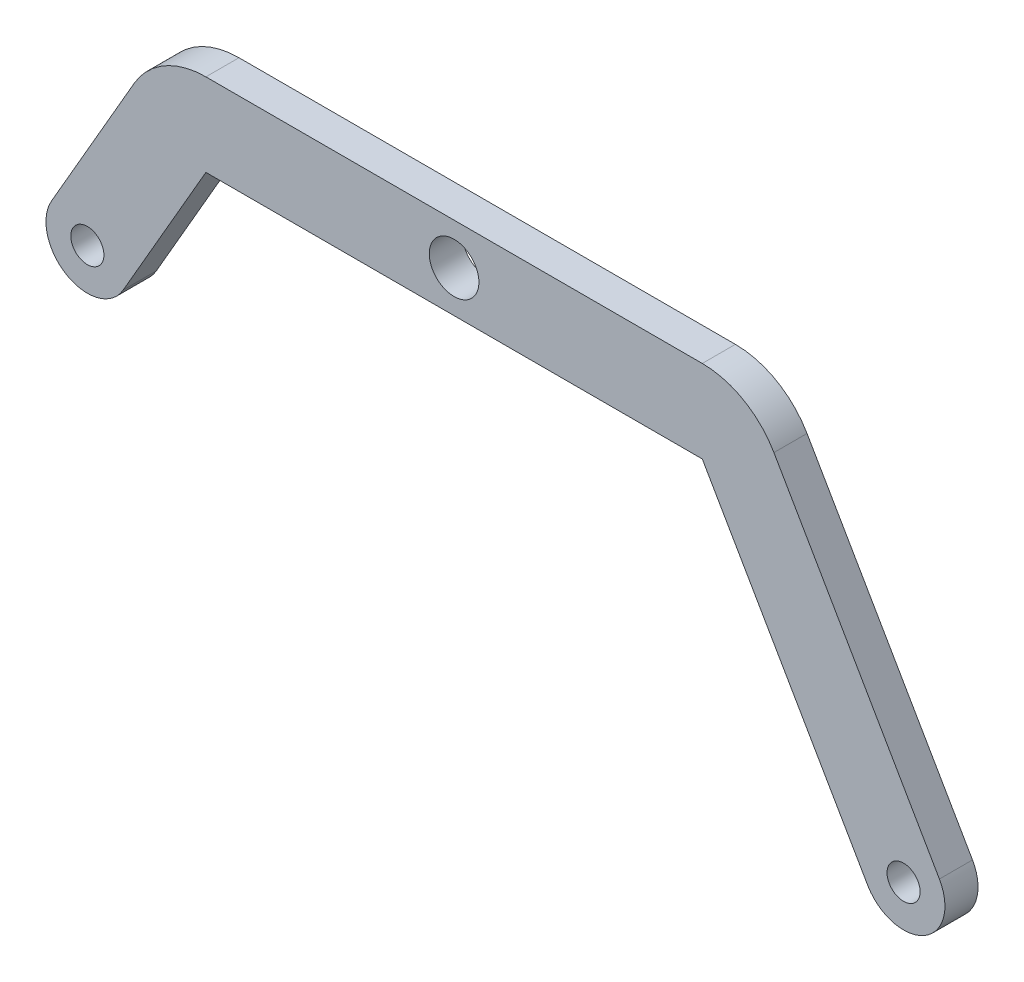
ISO-10303-21;
HEADER;
FILE_DESCRIPTION(('STEP AP214'),'2;1');
FILE_NAME('part.step','',(''),(''),'','','');
FILE_SCHEMA(('AUTOMOTIVE_DESIGN { 1 0 10303 214 1 1 1 1 }'));
ENDSEC;
DATA;
#1=APPLICATION_CONTEXT('core data for automotive mechanical design processes');
#2=APPLICATION_PROTOCOL_DEFINITION('international standard','automotive_design',2000,#1);
#3=PRODUCT_CONTEXT('',#1,'mechanical');
#4=PRODUCT('Part','Part','',(#3));
#5=PRODUCT_RELATED_PRODUCT_CATEGORY('part','',(#4));
#6=PRODUCT_DEFINITION_FORMATION('','',#4);
#7=PRODUCT_DEFINITION_CONTEXT('part definition',#1,'design');
#8=PRODUCT_DEFINITION('design','',#6,#7);
#9=PRODUCT_DEFINITION_SHAPE('','',#8);
#10=(LENGTH_UNIT() NAMED_UNIT(*) SI_UNIT(.MILLI.,.METRE.));
#11=(NAMED_UNIT(*) PLANE_ANGLE_UNIT() SI_UNIT($,.RADIAN.));
#12=(NAMED_UNIT(*) SI_UNIT($,.STERADIAN.) SOLID_ANGLE_UNIT());
#13=UNCERTAINTY_MEASURE_WITH_UNIT(LENGTH_MEASURE(1.E-05),#10,'distance_accuracy_value','');
#14=(GEOMETRIC_REPRESENTATION_CONTEXT(3) GLOBAL_UNCERTAINTY_ASSIGNED_CONTEXT((#13)) GLOBAL_UNIT_ASSIGNED_CONTEXT((#10,
#11,#12)) REPRESENTATION_CONTEXT('',''));
#15=CARTESIAN_POINT('',(0.,0.,0.));
#16=DIRECTION('',(0.,0.,1.));
#17=DIRECTION('',(1.,0.,0.));
#18=AXIS2_PLACEMENT_3D('',#15,#16,#17);
#19=CARTESIAN_POINT('',(-110.825317547306,-49.5512701892218,5.));
#20=DIRECTION('',(0.,0.,-1.));
#21=DIRECTION('',(-1.,0.,0.));
#22=AXIS2_PLACEMENT_3D('',#19,#20,#21);
#23=PLANE('',#22);
#24=DIRECTION('',(0.500000000000004,0.866025403784436,0.));
#25=VECTOR('',#24,1.);
#26=CARTESIAN_POINT('',(-75.,-12.5,5.));
#27=LINE('',#26,#25);
#28=CARTESIAN_POINT('',(-100.,-55.8012701892219,5.));
#29=VERTEX_POINT('',#28);
#30=CARTESIAN_POINT('',(-75.,-12.5,5.));
#31=VERTEX_POINT('',#30);
#32=EDGE_CURVE('E186',#29,#31,#27,.T.);
#33=ORIENTED_EDGE('',*,*,#32,.T.);
#34=DIRECTION('',(1.,0.,0.));
#35=VECTOR('',#34,1.);
#36=CARTESIAN_POINT('',(-75.,-12.5,5.));
#37=LINE('',#36,#35);
#38=CARTESIAN_POINT('',(75.,-12.5,5.));
#39=VERTEX_POINT('',#38);
#40=EDGE_CURVE('E110',#31,#39,#37,.T.);
#41=ORIENTED_EDGE('',*,*,#40,.T.);
#42=DIRECTION('',(0.500000000000008,-0.866025403784434,0.));
#43=VECTOR('',#42,1.);
#44=CARTESIAN_POINT('',(125.000000000001,-99.1025403784434,5.));
#45=LINE('',#44,#43);
#46=CARTESIAN_POINT('',(125.000000000001,-99.1025403784434,5.));
#47=VERTEX_POINT('',#46);
#48=EDGE_CURVE('E215',#39,#47,#45,.T.);
#49=ORIENTED_EDGE('',*,*,#48,.T.);
#50=CARTESIAN_POINT('',(135.825317547306,-92.8525403784436,5.));
#51=DIRECTION('',(0.,0.,1.));
#52=DIRECTION('',(-1.,0.,0.));
#53=AXIS2_PLACEMENT_3D('',#50,#51,#52);
#54=CIRCLE('',#53,12.4999999999998);
#55=CARTESIAN_POINT('',(146.650635094611,-86.6025403784436,5.));
#56=VERTEX_POINT('',#55);
#57=EDGE_CURVE('E235',#47,#56,#54,.T.);
#58=ORIENTED_EDGE('',*,*,#57,.T.);
#59=DIRECTION('',(-0.500000000000004,0.866025403784436,0.));
#60=VECTOR('',#59,1.);
#61=CARTESIAN_POINT('',(96.6506350946109,1.07552855510562E-13,5.));
#62=LINE('',#61,#60);
#63=CARTESIAN_POINT('',(96.6506350946109,1.07552855510562E-13,5.));
#64=VERTEX_POINT('',#63);
#65=EDGE_CURVE('E231',#56,#64,#62,.T.);
#66=ORIENTED_EDGE('',*,*,#65,.T.);
#67=CARTESIAN_POINT('',(75.,-12.5,5.));
#68=DIRECTION('',(0.,0.,1.));
#69=DIRECTION('',(-1.,0.,0.));
#70=AXIS2_PLACEMENT_3D('',#67,#68,#69);
#71=CIRCLE('',#70,25.);
#72=CARTESIAN_POINT('',(75.,12.5,5.));
#73=VERTEX_POINT('',#72);
#74=EDGE_CURVE('E234',#64,#73,#71,.T.);
#75=ORIENTED_EDGE('',*,*,#74,.T.);
#76=DIRECTION('',(-1.,0.,0.));
#77=VECTOR('',#76,1.);
#78=CARTESIAN_POINT('',(-75.,12.5,5.));
#79=LINE('',#78,#77);
#80=CARTESIAN_POINT('',(-75.,12.5,5.));
#81=VERTEX_POINT('',#80);
#82=EDGE_CURVE('E135',#73,#81,#79,.T.);
#83=ORIENTED_EDGE('',*,*,#82,.T.);
#84=CARTESIAN_POINT('',(-75.,-12.5,5.));
#85=DIRECTION('',(0.,0.,1.));
#86=DIRECTION('',(-1.,0.,0.));
#87=AXIS2_PLACEMENT_3D('',#84,#85,#86);
#88=CIRCLE('',#87,25.0000000000001);
#89=CARTESIAN_POINT('',(-96.650635094611,1.76941794549634E-13,5.));
#90=VERTEX_POINT('',#89);
#91=EDGE_CURVE('E129',#81,#90,#88,.T.);
#92=ORIENTED_EDGE('',*,*,#91,.T.);
#93=DIRECTION('',(-0.500000000000004,-0.866025403784436,0.));
#94=VECTOR('',#93,1.);
#95=CARTESIAN_POINT('',(-121.650635094611,-43.3012701892215,5.));
#96=LINE('',#95,#94);
#97=CARTESIAN_POINT('',(-121.650635094611,-43.3012701892215,5.));
#98=VERTEX_POINT('',#97);
#99=EDGE_CURVE('E133',#90,#98,#96,.T.);
#100=ORIENTED_EDGE('',*,*,#99,.T.);
#101=CARTESIAN_POINT('',(-110.825317547306,-49.5512701892218,5.));
#102=DIRECTION('',(0.,0.,1.));
#103=DIRECTION('',(-1.,0.,0.));
#104=AXIS2_PLACEMENT_3D('',#101,#102,#103);
#105=CIRCLE('',#104,12.5000000000001);
#106=EDGE_CURVE('E61',#98,#29,#105,.T.);
#107=ORIENTED_EDGE('',*,*,#106,.T.);
#108=EDGE_LOOP('',(#33,#41,#49,#58,#66,#75,#83,#92,#100,#107));
#109=FACE_BOUND('',#108,.T.);
#110=CARTESIAN_POINT('',(0.,0.,5.));
#111=DIRECTION('',(0.,0.,1.));
#112=DIRECTION('',(1.,0.,0.));
#113=AXIS2_PLACEMENT_3D('',#110,#111,#112);
#114=CIRCLE('',#113,7.5);
#115=CARTESIAN_POINT('',(7.5,0.,5.));
#116=VERTEX_POINT('',#115);
#117=EDGE_CURVE('E162',#116,#116,#114,.T.);
#118=ORIENTED_EDGE('',*,*,#117,.F.);
#119=EDGE_LOOP('',(#118));
#120=FACE_BOUND('',#119,.T.);
#121=CARTESIAN_POINT('',(135.825317547306,-92.8525403784436,5.));
#122=DIRECTION('',(0.,0.,1.));
#123=DIRECTION('',(1.,0.,0.));
#124=AXIS2_PLACEMENT_3D('',#121,#122,#123);
#125=CIRCLE('',#124,4.99999999999999);
#126=CARTESIAN_POINT('',(140.825317547306,-92.8525403784436,5.));
#127=VERTEX_POINT('',#126);
#128=EDGE_CURVE('E253',#127,#127,#125,.T.);
#129=ORIENTED_EDGE('',*,*,#128,.F.);
#130=EDGE_LOOP('',(#129));
#131=FACE_BOUND('',#130,.T.);
#132=CARTESIAN_POINT('',(-110.825317547306,-49.5512701892218,5.));
#133=DIRECTION('',(0.,0.,1.));
#134=DIRECTION('',(1.,0.,0.));
#135=AXIS2_PLACEMENT_3D('',#132,#133,#134);
#136=CIRCLE('',#135,5.00000000000002);
#137=CARTESIAN_POINT('',(-105.825317547306,-49.5512701892218,5.));
#138=VERTEX_POINT('',#137);
#139=EDGE_CURVE('E261',#138,#138,#136,.T.);
#140=ORIENTED_EDGE('',*,*,#139,.F.);
#141=EDGE_LOOP('',(#140));
#142=FACE_BOUND('',#141,.T.);
#143=ADVANCED_FACE('F43',(#109,#120,#131,#142),#23,.F.);
#144=CARTESIAN_POINT('',(-110.825317547306,-49.5512701892218,-5.));
#145=DIRECTION('',(0.,0.,-1.));
#146=DIRECTION('',(-1.,0.,0.));
#147=AXIS2_PLACEMENT_3D('',#144,#145,#146);
#148=PLANE('',#147);
#149=CARTESIAN_POINT('',(135.825317547306,-92.8525403784436,-5.));
#150=DIRECTION('',(0.,0.,1.));
#151=DIRECTION('',(1.,0.,0.));
#152=AXIS2_PLACEMENT_3D('',#149,#150,#151);
#153=CIRCLE('',#152,4.99999999999999);
#154=CARTESIAN_POINT('',(140.825317547306,-92.8525403784436,-5.));
#155=VERTEX_POINT('',#154);
#156=EDGE_CURVE('E257',#155,#155,#153,.T.);
#157=ORIENTED_EDGE('',*,*,#156,.T.);
#158=EDGE_LOOP('',(#157));
#159=FACE_BOUND('',#158,.T.);
#160=DIRECTION('',(0.500000000000004,0.866025403784436,0.));
#161=VECTOR('',#160,1.);
#162=CARTESIAN_POINT('',(-75.,-12.5,-5.));
#163=LINE('',#162,#161);
#164=CARTESIAN_POINT('',(-100.,-55.8012701892219,-5.));
#165=VERTEX_POINT('',#164);
#166=CARTESIAN_POINT('',(-75.,-12.5,-5.));
#167=VERTEX_POINT('',#166);
#168=EDGE_CURVE('E157',#165,#167,#163,.T.);
#169=ORIENTED_EDGE('',*,*,#168,.F.);
#170=CARTESIAN_POINT('',(-110.825317547306,-49.5512701892218,-5.));
#171=DIRECTION('',(0.,0.,1.));
#172=DIRECTION('',(-1.,0.,0.));
#173=AXIS2_PLACEMENT_3D('',#170,#171,#172);
#174=CIRCLE('',#173,12.5000000000001);
#175=CARTESIAN_POINT('',(-121.650635094611,-43.3012701892215,-5.));
#176=VERTEX_POINT('',#175);
#177=EDGE_CURVE('E102',#176,#165,#174,.T.);
#178=ORIENTED_EDGE('',*,*,#177,.F.);
#179=DIRECTION('',(-0.500000000000004,-0.866025403784436,0.));
#180=VECTOR('',#179,1.);
#181=CARTESIAN_POINT('',(-121.650635094611,-43.3012701892215,-5.));
#182=LINE('',#181,#180);
#183=CARTESIAN_POINT('',(-96.650635094611,1.76941794549634E-13,-5.));
#184=VERTEX_POINT('',#183);
#185=EDGE_CURVE('E96',#184,#176,#182,.T.);
#186=ORIENTED_EDGE('',*,*,#185,.F.);
#187=CARTESIAN_POINT('',(-75.,-12.5,-5.));
#188=DIRECTION('',(0.,0.,1.));
#189=DIRECTION('',(-1.,0.,0.));
#190=AXIS2_PLACEMENT_3D('',#187,#188,#189);
#191=CIRCLE('',#190,25.0000000000001);
#192=CARTESIAN_POINT('',(-75.,12.5,-5.));
#193=VERTEX_POINT('',#192);
#194=EDGE_CURVE('E144',#193,#184,#191,.T.);
#195=ORIENTED_EDGE('',*,*,#194,.F.);
#196=DIRECTION('',(-1.,0.,0.));
#197=VECTOR('',#196,1.);
#198=CARTESIAN_POINT('',(-75.,12.5,-5.));
#199=LINE('',#198,#197);
#200=CARTESIAN_POINT('',(75.,12.5,-5.));
#201=VERTEX_POINT('',#200);
#202=EDGE_CURVE('E177',#201,#193,#199,.T.);
#203=ORIENTED_EDGE('',*,*,#202,.F.);
#204=CARTESIAN_POINT('',(75.,-12.5,-5.));
#205=DIRECTION('',(0.,0.,1.));
#206=DIRECTION('',(-1.,0.,0.));
#207=AXIS2_PLACEMENT_3D('',#204,#205,#206);
#208=CIRCLE('',#207,25.);
#209=CARTESIAN_POINT('',(96.6506350946109,1.07552855510562E-13,-5.));
#210=VERTEX_POINT('',#209);
#211=EDGE_CURVE('E174',#210,#201,#208,.T.);
#212=ORIENTED_EDGE('',*,*,#211,.F.);
#213=DIRECTION('',(-0.500000000000004,0.866025403784436,0.));
#214=VECTOR('',#213,1.);
#215=CARTESIAN_POINT('',(96.6506350946109,1.07552855510562E-13,-5.));
#216=LINE('',#215,#214);
#217=CARTESIAN_POINT('',(146.650635094611,-86.6025403784436,-5.));
#218=VERTEX_POINT('',#217);
#219=EDGE_CURVE('E171',#218,#210,#216,.T.);
#220=ORIENTED_EDGE('',*,*,#219,.F.);
#221=CARTESIAN_POINT('',(135.825317547306,-92.8525403784436,-5.));
#222=DIRECTION('',(0.,0.,1.));
#223=DIRECTION('',(-1.,0.,0.));
#224=AXIS2_PLACEMENT_3D('',#221,#222,#223);
#225=CIRCLE('',#224,12.4999999999998);
#226=CARTESIAN_POINT('',(125.000000000001,-99.1025403784434,-5.));
#227=VERTEX_POINT('',#226);
#228=EDGE_CURVE('E168',#227,#218,#225,.T.);
#229=ORIENTED_EDGE('',*,*,#228,.F.);
#230=DIRECTION('',(0.500000000000008,-0.866025403784434,0.));
#231=VECTOR('',#230,1.);
#232=CARTESIAN_POINT('',(125.000000000001,-99.1025403784434,-5.));
#233=LINE('',#232,#231);
#234=CARTESIAN_POINT('',(75.,-12.5,-5.));
#235=VERTEX_POINT('',#234);
#236=EDGE_CURVE('E165',#235,#227,#233,.T.);
#237=ORIENTED_EDGE('',*,*,#236,.F.);
#238=DIRECTION('',(1.,0.,0.));
#239=VECTOR('',#238,1.);
#240=CARTESIAN_POINT('',(-75.,-12.5,-5.));
#241=LINE('',#240,#239);
#242=EDGE_CURVE('E161',#167,#235,#241,.T.);
#243=ORIENTED_EDGE('',*,*,#242,.F.);
#244=EDGE_LOOP('',(#169,#178,#186,#195,#203,#212,#220,#229,#237,#243));
#245=FACE_BOUND('',#244,.T.);
#246=CARTESIAN_POINT('',(0.,0.,-5.));
#247=DIRECTION('',(0.,0.,1.));
#248=DIRECTION('',(1.,0.,0.));
#249=AXIS2_PLACEMENT_3D('',#246,#247,#248);
#250=CIRCLE('',#249,7.5);
#251=CARTESIAN_POINT('',(7.5,0.,-5.));
#252=VERTEX_POINT('',#251);
#253=EDGE_CURVE('E249',#252,#252,#250,.T.);
#254=ORIENTED_EDGE('',*,*,#253,.T.);
#255=EDGE_LOOP('',(#254));
#256=FACE_BOUND('',#255,.T.);
#257=CARTESIAN_POINT('',(-110.825317547306,-49.5512701892218,-5.));
#258=DIRECTION('',(0.,0.,1.));
#259=DIRECTION('',(1.,0.,0.));
#260=AXIS2_PLACEMENT_3D('',#257,#258,#259);
#261=CIRCLE('',#260,5.00000000000002);
#262=CARTESIAN_POINT('',(-105.825317547306,-49.5512701892218,-5.));
#263=VERTEX_POINT('',#262);
#264=EDGE_CURVE('E265',#263,#263,#261,.T.);
#265=ORIENTED_EDGE('',*,*,#264,.T.);
#266=EDGE_LOOP('',(#265));
#267=FACE_BOUND('',#266,.T.);
#268=ADVANCED_FACE('F219',(#159,#245,#256,#267),#148,.T.);
#269=CARTESIAN_POINT('',(-75.,-12.5,5.));
#270=DIRECTION('',(-0.866025403784436,0.500000000000004,0.));
#271=DIRECTION('',(-0.500000000000004,-0.866025403784436,0.));
#272=AXIS2_PLACEMENT_3D('',#269,#270,#271);
#273=PLANE('',#272);
#274=ORIENTED_EDGE('',*,*,#168,.T.);
#275=DIRECTION('',(0.,0.,-1.));
#276=VECTOR('',#275,1.);
#277=CARTESIAN_POINT('',(-75.,-12.5,5.));
#278=LINE('',#277,#276);
#279=EDGE_CURVE('E11',#31,#167,#278,.T.);
#280=ORIENTED_EDGE('',*,*,#279,.F.);
#281=ORIENTED_EDGE('',*,*,#32,.F.);
#282=DIRECTION('',(0.,0.,-1.));
#283=VECTOR('',#282,1.);
#284=CARTESIAN_POINT('',(-100.,-55.8012701892219,5.));
#285=LINE('',#284,#283);
#286=EDGE_CURVE('E153',#29,#165,#285,.T.);
#287=ORIENTED_EDGE('',*,*,#286,.T.);
#288=EDGE_LOOP('',(#274,#280,#281,#287));
#289=FACE_BOUND('',#288,.T.);
#290=ADVANCED_FACE('F45',(#289),#273,.F.);
#291=CARTESIAN_POINT('',(-75.,-12.5,5.));
#292=DIRECTION('',(0.,1.,0.));
#293=DIRECTION('',(0.,0.,1.));
#294=AXIS2_PLACEMENT_3D('',#291,#292,#293);
#295=PLANE('',#294);
#296=ORIENTED_EDGE('',*,*,#242,.T.);
#297=DIRECTION('',(0.,0.,-1.));
#298=VECTOR('',#297,1.);
#299=CARTESIAN_POINT('',(75.,-12.5,5.));
#300=LINE('',#299,#298);
#301=EDGE_CURVE('E53',#39,#235,#300,.T.);
#302=ORIENTED_EDGE('',*,*,#301,.F.);
#303=ORIENTED_EDGE('',*,*,#40,.F.);
#304=ORIENTED_EDGE('',*,*,#279,.T.);
#305=EDGE_LOOP('',(#296,#302,#303,#304));
#306=FACE_BOUND('',#305,.T.);
#307=ADVANCED_FACE('F307',(#306),#295,.F.);
#308=CARTESIAN_POINT('',(125.000000000001,-99.1025403784434,5.));
#309=DIRECTION('',(0.866025403784434,0.500000000000008,0.));
#310=DIRECTION('',(-0.500000000000008,0.866025403784434,0.));
#311=AXIS2_PLACEMENT_3D('',#308,#309,#310);
#312=PLANE('',#311);
#313=ORIENTED_EDGE('',*,*,#236,.T.);
#314=DIRECTION('',(0.,0.,-1.));
#315=VECTOR('',#314,1.);
#316=CARTESIAN_POINT('',(125.000000000001,-99.1025403784434,5.));
#317=LINE('',#316,#315);
#318=EDGE_CURVE('E205',#47,#227,#317,.T.);
#319=ORIENTED_EDGE('',*,*,#318,.F.);
#320=ORIENTED_EDGE('',*,*,#48,.F.);
#321=ORIENTED_EDGE('',*,*,#301,.T.);
#322=EDGE_LOOP('',(#313,#319,#320,#321));
#323=FACE_BOUND('',#322,.T.);
#324=ADVANCED_FACE('F213',(#323),#312,.F.);
#325=CARTESIAN_POINT('',(135.825317547306,-92.8525403784436,5.));
#326=DIRECTION('',(0.,0.,-1.));
#327=DIRECTION('',(-1.,0.,0.));
#328=AXIS2_PLACEMENT_3D('',#325,#326,#327);
#329=CYLINDRICAL_SURFACE('',#328,12.4999999999998);
#330=ORIENTED_EDGE('',*,*,#228,.T.);
#331=DIRECTION('',(0.,0.,-1.));
#332=VECTOR('',#331,1.);
#333=CARTESIAN_POINT('',(146.650635094611,-86.6025403784436,5.));
#334=LINE('',#333,#332);
#335=EDGE_CURVE('E201',#56,#218,#334,.T.);
#336=ORIENTED_EDGE('',*,*,#335,.F.);
#337=ORIENTED_EDGE('',*,*,#57,.F.);
#338=ORIENTED_EDGE('',*,*,#318,.T.);
#339=EDGE_LOOP('',(#330,#336,#337,#338));
#340=FACE_BOUND('',#339,.T.);
#341=ADVANCED_FACE('F225',(#340),#329,.T.);
#342=CARTESIAN_POINT('',(96.6506350946109,1.07552855510562E-13,5.));
#343=DIRECTION('',(-0.866025403784436,-0.500000000000004,0.));
#344=DIRECTION('',(0.500000000000004,-0.866025403784436,0.));
#345=AXIS2_PLACEMENT_3D('',#342,#343,#344);
#346=PLANE('',#345);
#347=ORIENTED_EDGE('',*,*,#219,.T.);
#348=DIRECTION('',(0.,0.,-1.));
#349=VECTOR('',#348,1.);
#350=CARTESIAN_POINT('',(96.6506350946109,1.07552855510562E-13,5.));
#351=LINE('',#350,#349);
#352=EDGE_CURVE('E197',#64,#210,#351,.T.);
#353=ORIENTED_EDGE('',*,*,#352,.F.);
#354=ORIENTED_EDGE('',*,*,#65,.F.);
#355=ORIENTED_EDGE('',*,*,#335,.T.);
#356=EDGE_LOOP('',(#347,#353,#354,#355));
#357=FACE_BOUND('',#356,.T.);
#358=ADVANCED_FACE('F229',(#357),#346,.F.);
#359=CARTESIAN_POINT('',(75.,-12.5,5.));
#360=DIRECTION('',(0.,0.,-1.));
#361=DIRECTION('',(-1.,0.,0.));
#362=AXIS2_PLACEMENT_3D('',#359,#360,#361);
#363=CYLINDRICAL_SURFACE('',#362,25.);
#364=ORIENTED_EDGE('',*,*,#211,.T.);
#365=DIRECTION('',(0.,0.,-1.));
#366=VECTOR('',#365,1.);
#367=CARTESIAN_POINT('',(75.,12.5,5.));
#368=LINE('',#367,#366);
#369=EDGE_CURVE('E193',#73,#201,#368,.T.);
#370=ORIENTED_EDGE('',*,*,#369,.F.);
#371=ORIENTED_EDGE('',*,*,#74,.F.);
#372=ORIENTED_EDGE('',*,*,#352,.T.);
#373=EDGE_LOOP('',(#364,#370,#371,#372));
#374=FACE_BOUND('',#373,.T.);
#375=ADVANCED_FACE('F297',(#374),#363,.T.);
#376=CARTESIAN_POINT('',(-75.,12.5,5.));
#377=DIRECTION('',(0.,-1.,0.));
#378=DIRECTION('',(1.,0.,0.));
#379=AXIS2_PLACEMENT_3D('',#376,#377,#378);
#380=PLANE('',#379);
#381=ORIENTED_EDGE('',*,*,#202,.T.);
#382=DIRECTION('',(0.,0.,-1.));
#383=VECTOR('',#382,1.);
#384=CARTESIAN_POINT('',(-75.,12.5,5.));
#385=LINE('',#384,#383);
#386=EDGE_CURVE('E146',#81,#193,#385,.T.);
#387=ORIENTED_EDGE('',*,*,#386,.F.);
#388=ORIENTED_EDGE('',*,*,#82,.F.);
#389=ORIENTED_EDGE('',*,*,#369,.T.);
#390=EDGE_LOOP('',(#381,#387,#388,#389));
#391=FACE_BOUND('',#390,.T.);
#392=ADVANCED_FACE('F294',(#391),#380,.F.);
#393=CARTESIAN_POINT('',(-75.,-12.5,5.));
#394=DIRECTION('',(0.,0.,-1.));
#395=DIRECTION('',(-1.,0.,0.));
#396=AXIS2_PLACEMENT_3D('',#393,#394,#395);
#397=CYLINDRICAL_SURFACE('',#396,25.0000000000001);
#398=ORIENTED_EDGE('',*,*,#194,.T.);
#399=DIRECTION('',(0.,0.,-1.));
#400=VECTOR('',#399,1.);
#401=CARTESIAN_POINT('',(-96.650635094611,1.76941794549634E-13,5.));
#402=LINE('',#401,#400);
#403=EDGE_CURVE('E141',#90,#184,#402,.T.);
#404=ORIENTED_EDGE('',*,*,#403,.F.);
#405=ORIENTED_EDGE('',*,*,#91,.F.);
#406=ORIENTED_EDGE('',*,*,#386,.T.);
#407=EDGE_LOOP('',(#398,#404,#405,#406));
#408=FACE_BOUND('',#407,.T.);
#409=ADVANCED_FACE('F142',(#408),#397,.T.);
#410=CARTESIAN_POINT('',(-121.650635094611,-43.3012701892215,5.));
#411=DIRECTION('',(0.866025403784436,-0.500000000000004,0.));
#412=DIRECTION('',(0.500000000000004,0.866025403784436,0.));
#413=AXIS2_PLACEMENT_3D('',#410,#411,#412);
#414=PLANE('',#413);
#415=ORIENTED_EDGE('',*,*,#185,.T.);
#416=DIRECTION('',(0.,0.,-1.));
#417=VECTOR('',#416,1.);
#418=CARTESIAN_POINT('',(-121.650635094611,-43.3012701892215,5.));
#419=LINE('',#418,#417);
#420=EDGE_CURVE('E147',#98,#176,#419,.T.);
#421=ORIENTED_EDGE('',*,*,#420,.F.);
#422=ORIENTED_EDGE('',*,*,#99,.F.);
#423=ORIENTED_EDGE('',*,*,#403,.T.);
#424=EDGE_LOOP('',(#415,#421,#422,#423));
#425=FACE_BOUND('',#424,.T.);
#426=ADVANCED_FACE('F149',(#425),#414,.F.);
#427=CARTESIAN_POINT('',(-110.825317547306,-49.5512701892218,5.));
#428=DIRECTION('',(0.,0.,-1.));
#429=DIRECTION('',(-1.,0.,0.));
#430=AXIS2_PLACEMENT_3D('',#427,#428,#429);
#431=CYLINDRICAL_SURFACE('',#430,12.5000000000001);
#432=ORIENTED_EDGE('',*,*,#177,.T.);
#433=ORIENTED_EDGE('',*,*,#286,.F.);
#434=ORIENTED_EDGE('',*,*,#106,.F.);
#435=ORIENTED_EDGE('',*,*,#420,.T.);
#436=EDGE_LOOP('',(#432,#433,#434,#435));
#437=FACE_BOUND('',#436,.T.);
#438=ADVANCED_FACE('F287',(#437),#431,.T.);
#439=CARTESIAN_POINT('',(0.,0.,5.));
#440=DIRECTION('',(0.,0.,-1.));
#441=DIRECTION('',(-1.,0.,0.));
#442=AXIS2_PLACEMENT_3D('',#439,#440,#441);
#443=CYLINDRICAL_SURFACE('',#442,7.5);
#444=ORIENTED_EDGE('',*,*,#117,.T.);
#445=EDGE_LOOP('',(#444));
#446=FACE_BOUND('',#445,.T.);
#447=ORIENTED_EDGE('',*,*,#253,.F.);
#448=EDGE_LOOP('',(#447));
#449=FACE_BOUND('',#448,.T.);
#450=ADVANCED_FACE('F284',(#446,#449),#443,.F.);
#451=CARTESIAN_POINT('',(135.825317547306,-92.8525403784436,5.));
#452=DIRECTION('',(0.,0.,-1.));
#453=DIRECTION('',(-1.,0.,0.));
#454=AXIS2_PLACEMENT_3D('',#451,#452,#453);
#455=CYLINDRICAL_SURFACE('',#454,4.99999999999999);
#456=ORIENTED_EDGE('',*,*,#128,.T.);
#457=EDGE_LOOP('',(#456));
#458=FACE_BOUND('',#457,.T.);
#459=ORIENTED_EDGE('',*,*,#156,.F.);
#460=EDGE_LOOP('',(#459));
#461=FACE_BOUND('',#460,.T.);
#462=ADVANCED_FACE('F397',(#458,#461),#455,.F.);
#463=CARTESIAN_POINT('',(-110.825317547306,-49.5512701892218,5.));
#464=DIRECTION('',(0.,0.,-1.));
#465=DIRECTION('',(-1.,0.,0.));
#466=AXIS2_PLACEMENT_3D('',#463,#464,#465);
#467=CYLINDRICAL_SURFACE('',#466,5.00000000000002);
#468=ORIENTED_EDGE('',*,*,#139,.T.);
#469=EDGE_LOOP('',(#468));
#470=FACE_BOUND('',#469,.T.);
#471=ORIENTED_EDGE('',*,*,#264,.F.);
#472=EDGE_LOOP('',(#471));
#473=FACE_BOUND('',#472,.T.);
#474=ADVANCED_FACE('F273',(#470,#473),#467,.F.);
#475=CLOSED_SHELL('',(#143,#268,#290,#307,#324,#341,#358,#375,#392,#409,#426,#438,#450,#462,#474));
#476=MANIFOLD_SOLID_BREP('B2',#475);
#477=ADVANCED_BREP_SHAPE_REPRESENTATION('',(#18,#476),#14);
#478=SHAPE_DEFINITION_REPRESENTATION(#9,#477);
ENDSEC;
END-ISO-10303-21;
